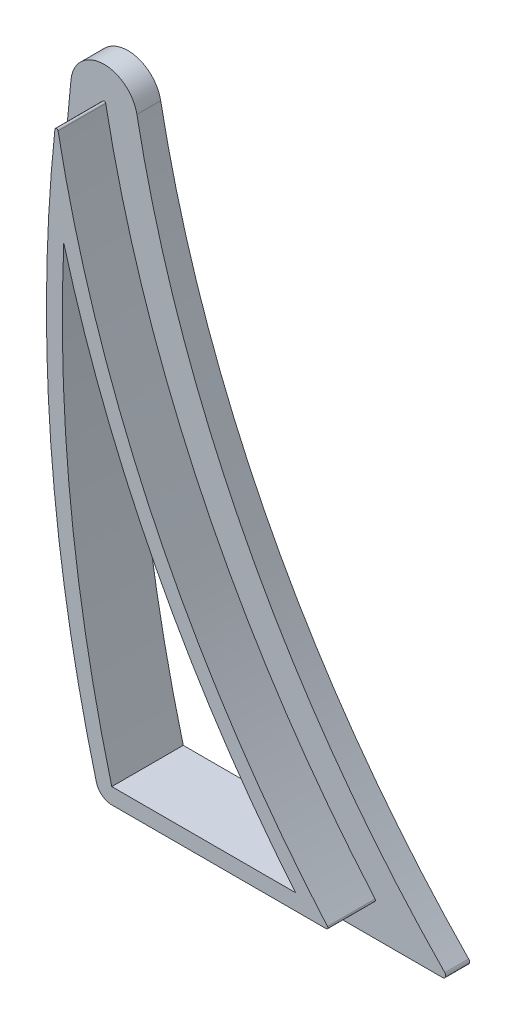
ISO-10303-21;
HEADER;
FILE_DESCRIPTION(('STEP AP214'),'2;1');
FILE_NAME('part.step','',(''),(''),'','','');
FILE_SCHEMA(('AUTOMOTIVE_DESIGN { 1 0 10303 214 1 1 1 1 }'));
ENDSEC;
DATA;
#1=APPLICATION_CONTEXT('core data for automotive mechanical design processes');
#2=APPLICATION_PROTOCOL_DEFINITION('international standard','automotive_design',2000,#1);
#3=PRODUCT_CONTEXT('',#1,'mechanical');
#4=PRODUCT('Part','Part','',(#3));
#5=PRODUCT_RELATED_PRODUCT_CATEGORY('part','',(#4));
#6=PRODUCT_DEFINITION_FORMATION('','',#4);
#7=PRODUCT_DEFINITION_CONTEXT('part definition',#1,'design');
#8=PRODUCT_DEFINITION('design','',#6,#7);
#9=PRODUCT_DEFINITION_SHAPE('','',#8);
#10=(LENGTH_UNIT() NAMED_UNIT(*) SI_UNIT(.MILLI.,.METRE.));
#11=(NAMED_UNIT(*) PLANE_ANGLE_UNIT() SI_UNIT($,.RADIAN.));
#12=(NAMED_UNIT(*) SI_UNIT($,.STERADIAN.) SOLID_ANGLE_UNIT());
#13=UNCERTAINTY_MEASURE_WITH_UNIT(LENGTH_MEASURE(1.E-05),#10,'distance_accuracy_value','');
#14=(GEOMETRIC_REPRESENTATION_CONTEXT(3) GLOBAL_UNCERTAINTY_ASSIGNED_CONTEXT((#13)) GLOBAL_UNIT_ASSIGNED_CONTEXT((#10,
#11,#12)) REPRESENTATION_CONTEXT('',''));
#15=CARTESIAN_POINT('',(0.,0.,0.));
#16=DIRECTION('',(0.,0.,1.));
#17=DIRECTION('',(1.,0.,0.));
#18=AXIS2_PLACEMENT_3D('',#15,#16,#17);
#19=CARTESIAN_POINT('',(65.7323224991207,31.1375568016993,3.));
#20=DIRECTION('',(0.,0.,-1.));
#21=DIRECTION('',(-1.,0.,0.));
#22=AXIS2_PLACEMENT_3D('',#19,#20,#21);
#23=CYLINDRICAL_SURFACE('',#22,75.);
#24=CARTESIAN_POINT('',(65.7323224991207,31.1375568016993,3.));
#25=DIRECTION('',(0.,0.,1.));
#26=DIRECTION('',(1.,0.,0.));
#27=AXIS2_PLACEMENT_3D('',#24,#25,#26);
#28=CIRCLE('',#27,75.);
#29=CARTESIAN_POINT('',(-7.90817231299797,16.9221593810739,3.));
#30=VERTEX_POINT('',#29);
#31=CARTESIAN_POINT('',(9.0550928824167,-17.9816007946541,3.));
#32=VERTEX_POINT('',#31);
#33=EDGE_CURVE('E261',#30,#32,#28,.T.);
#34=ORIENTED_EDGE('',*,*,#33,.T.);
#35=DIRECTION('',(0.,0.,-1.));
#36=VECTOR('',#35,1.);
#37=CARTESIAN_POINT('',(9.05509288241668,-17.9816007946541,3.));
#38=LINE('',#37,#36);
#39=CARTESIAN_POINT('',(9.0550928824167,-17.9816007946541,0.));
#40=VERTEX_POINT('',#39);
#41=EDGE_CURVE('E325',#32,#40,#38,.T.);
#42=ORIENTED_EDGE('',*,*,#41,.T.);
#43=CARTESIAN_POINT('',(65.7323224991207,31.1375568016993,0.));
#44=DIRECTION('',(0.,0.,1.));
#45=DIRECTION('',(1.,0.,0.));
#46=AXIS2_PLACEMENT_3D('',#43,#44,#45);
#47=CIRCLE('',#46,75.);
#48=CARTESIAN_POINT('',(-7.90817231299797,16.9221593810739,0.));
#49=VERTEX_POINT('',#48);
#50=EDGE_CURVE('E243',#49,#40,#47,.T.);
#51=ORIENTED_EDGE('',*,*,#50,.F.);
#52=DIRECTION('',(0.,0.,-1.));
#53=VECTOR('',#52,1.);
#54=CARTESIAN_POINT('',(-7.90817231299798,16.9221593810739,3.));
#55=LINE('',#54,#53);
#56=EDGE_CURVE('E306',#49,#30,#55,.F.);
#57=ORIENTED_EDGE('',*,*,#56,.T.);
#58=EDGE_LOOP('',(#34,#42,#51,#57));
#59=FACE_BOUND('',#58,.T.);
#60=ADVANCED_FACE('F63',(#59),#23,.F.);
#61=CARTESIAN_POINT('',(86.3599558529587,6.85290699521738,3.));
#62=DIRECTION('',(0.,0.,-1.));
#63=DIRECTION('',(-1.,0.,0.));
#64=AXIS2_PLACEMENT_3D('',#61,#62,#63);
#65=CYLINDRICAL_SURFACE('',#64,95.);
#66=CARTESIAN_POINT('',(86.3599558529587,6.85290699521738,3.));
#67=DIRECTION('',(0.,0.,1.));
#68=DIRECTION('',(1.,0.,0.));
#69=AXIS2_PLACEMENT_3D('',#66,#67,#68);
#70=CIRCLE('',#69,95.);
#71=CARTESIAN_POINT('',(-8.1057972742849,16.9137959272485,3.));
#72=VERTEX_POINT('',#71);
#73=CARTESIAN_POINT('',(-5.49144311833216,-17.4024121537188,3.));
#74=VERTEX_POINT('',#73);
#75=EDGE_CURVE('E265',#72,#74,#70,.T.);
#76=ORIENTED_EDGE('',*,*,#75,.F.);
#77=DIRECTION('',(0.,0.,-1.));
#78=VECTOR('',#77,1.);
#79=CARTESIAN_POINT('',(-8.1057972742849,16.9137959272485,3.));
#80=LINE('',#79,#78);
#81=CARTESIAN_POINT('',(-8.1057972742849,16.9137959272485,0.));
#82=VERTEX_POINT('',#81);
#83=EDGE_CURVE('E294',#72,#82,#80,.T.);
#84=ORIENTED_EDGE('',*,*,#83,.T.);
#85=CARTESIAN_POINT('',(86.3599558529587,6.85290699521738,0.));
#86=DIRECTION('',(0.,0.,1.));
#87=DIRECTION('',(1.,0.,0.));
#88=AXIS2_PLACEMENT_3D('',#85,#86,#87);
#89=CIRCLE('',#88,95.);
#90=CARTESIAN_POINT('',(-5.49144311833216,-17.4024121537188,0.));
#91=VERTEX_POINT('',#90);
#92=EDGE_CURVE('E276',#82,#91,#89,.T.);
#93=ORIENTED_EDGE('',*,*,#92,.T.);
#94=DIRECTION('',(0.,0.,-1.));
#95=VECTOR('',#94,1.);
#96=CARTESIAN_POINT('',(-5.49144311833216,-17.4024121537188,3.));
#97=LINE('',#96,#95);
#98=EDGE_CURVE('E290',#74,#91,#97,.T.);
#99=ORIENTED_EDGE('',*,*,#98,.F.);
#100=EDGE_LOOP('',(#76,#84,#93,#99));
#101=FACE_BOUND('',#100,.T.);
#102=ADVANCED_FACE('F349',(#101),#65,.T.);
#103=CARTESIAN_POINT('',(-4.52458628705541,-17.1470930047826,3.));
#104=DIRECTION('',(0.,0.,-1.));
#105=DIRECTION('',(-1.,0.,0.));
#106=AXIS2_PLACEMENT_3D('',#103,#104,#105);
#107=CYLINDRICAL_SURFACE('',#106,0.999999999999999);
#108=CARTESIAN_POINT('',(-4.52458628705541,-17.1470930047826,0.));
#109=DIRECTION('',(0.,0.,1.));
#110=DIRECTION('',(1.,0.,0.));
#111=AXIS2_PLACEMENT_3D('',#108,#109,#110);
#112=CIRCLE('',#111,0.999999999999999);
#113=CARTESIAN_POINT('',(-4.52458628705541,-18.1470930047826,0.));
#114=VERTEX_POINT('',#113);
#115=EDGE_CURVE('E280',#91,#114,#112,.T.);
#116=ORIENTED_EDGE('',*,*,#115,.T.);
#117=DIRECTION('',(0.,0.,-1.));
#118=VECTOR('',#117,1.);
#119=CARTESIAN_POINT('',(-4.52458628705541,-18.1470930047826,3.));
#120=LINE('',#119,#118);
#121=CARTESIAN_POINT('',(-4.52458628705541,-18.1470930047826,3.));
#122=VERTEX_POINT('',#121);
#123=EDGE_CURVE('E286',#122,#114,#120,.T.);
#124=ORIENTED_EDGE('',*,*,#123,.F.);
#125=CARTESIAN_POINT('',(-4.52458628705541,-17.1470930047826,3.));
#126=DIRECTION('',(0.,0.,1.));
#127=DIRECTION('',(1.,0.,0.));
#128=AXIS2_PLACEMENT_3D('',#125,#126,#127);
#129=CIRCLE('',#128,0.999999999999999);
#130=EDGE_CURVE('E268',#74,#122,#129,.T.);
#131=ORIENTED_EDGE('',*,*,#130,.F.);
#132=ORIENTED_EDGE('',*,*,#98,.T.);
#133=EDGE_LOOP('',(#116,#124,#131,#132));
#134=FACE_BOUND('',#133,.T.);
#135=ADVANCED_FACE('F354',(#134),#107,.T.);
#136=CARTESIAN_POINT('',(86.3599558529587,6.85290699521738,3.));
#137=DIRECTION('',(0.,0.,-1.));
#138=DIRECTION('',(-1.,0.,0.));
#139=AXIS2_PLACEMENT_3D('',#136,#137,#138);
#140=CYLINDRICAL_SURFACE('',#139,94.);
#141=DIRECTION('',(0.,0.,-1.));
#142=VECTOR('',#141,1.);
#143=CARTESIAN_POINT('',(-4.52458628705541,-17.1470930047826,3.));
#144=LINE('',#143,#142);
#145=CARTESIAN_POINT('',(-4.52458628705541,-17.1470930047826,3.));
#146=VERTEX_POINT('',#145);
#147=CARTESIAN_POINT('',(-4.52458628705541,-17.1470930047826,-1.5));
#148=VERTEX_POINT('',#147);
#149=EDGE_CURVE('E169',#146,#148,#144,.T.);
#150=ORIENTED_EDGE('',*,*,#149,.T.);
#151=CARTESIAN_POINT('',(86.3599558529587,6.85290699521738,-1.5));
#152=DIRECTION('',(0.,0.,1.));
#153=DIRECTION('',(1.,0.,0.));
#154=AXIS2_PLACEMENT_3D('',#151,#152,#153);
#155=CIRCLE('',#154,94.);
#156=CARTESIAN_POINT('',(-7.54889357039104,10.9915057898128,-1.5));
#157=VERTEX_POINT('',#156);
#158=EDGE_CURVE('E173',#148,#157,#155,.F.);
#159=ORIENTED_EDGE('',*,*,#158,.T.);
#160=DIRECTION('',(0.,0.,-1.));
#161=VECTOR('',#160,1.);
#162=CARTESIAN_POINT('',(-7.54889357039104,10.9915057898128,3.));
#163=LINE('',#162,#161);
#164=CARTESIAN_POINT('',(-7.54889357039104,10.9915057898128,3.));
#165=VERTEX_POINT('',#164);
#166=EDGE_CURVE('E291',#165,#157,#163,.T.);
#167=ORIENTED_EDGE('',*,*,#166,.F.);
#168=CARTESIAN_POINT('',(86.3599558529587,6.85290699521738,3.));
#169=DIRECTION('',(0.,0.,1.));
#170=DIRECTION('',(1.,0.,0.));
#171=AXIS2_PLACEMENT_3D('',#168,#169,#170);
#172=CIRCLE('',#171,94.);
#173=EDGE_CURVE('E176',#165,#146,#172,.T.);
#174=ORIENTED_EDGE('',*,*,#173,.T.);
#175=EDGE_LOOP('',(#150,#159,#167,#174));
#176=FACE_BOUND('',#175,.T.);
#177=ADVANCED_FACE('F171',(#176),#140,.F.);
#178=CARTESIAN_POINT('',(65.7323224991207,31.1375568016993,3.));
#179=DIRECTION('',(0.,0.,-1.));
#180=DIRECTION('',(-1.,0.,0.));
#181=AXIS2_PLACEMENT_3D('',#178,#179,#180);
#182=CYLINDRICAL_SURFACE('',#181,76.);
#183=ORIENTED_EDGE('',*,*,#166,.T.);
#184=CARTESIAN_POINT('',(65.7323224991207,31.1375568016993,-1.5));
#185=DIRECTION('',(0.,0.,1.));
#186=DIRECTION('',(1.,0.,0.));
#187=AXIS2_PLACEMENT_3D('',#184,#185,#186);
#188=CIRCLE('',#187,76.);
#189=CARTESIAN_POINT('',(7.04167083239099,-17.1470930047826,-1.5));
#190=VERTEX_POINT('',#189);
#191=EDGE_CURVE('E191',#157,#190,#188,.T.);
#192=ORIENTED_EDGE('',*,*,#191,.T.);
#193=DIRECTION('',(0.,0.,-1.));
#194=VECTOR('',#193,1.);
#195=CARTESIAN_POINT('',(7.04167083239099,-17.1470930047826,3.));
#196=LINE('',#195,#194);
#197=CARTESIAN_POINT('',(7.04167083239099,-17.1470930047826,3.));
#198=VERTEX_POINT('',#197);
#199=EDGE_CURVE('E181',#198,#190,#196,.T.);
#200=ORIENTED_EDGE('',*,*,#199,.F.);
#201=CARTESIAN_POINT('',(65.7323224991207,31.1375568016993,3.));
#202=DIRECTION('',(0.,0.,1.));
#203=DIRECTION('',(1.,0.,0.));
#204=AXIS2_PLACEMENT_3D('',#201,#202,#203);
#205=CIRCLE('',#204,76.);
#206=EDGE_CURVE('E254',#165,#198,#205,.T.);
#207=ORIENTED_EDGE('',*,*,#206,.F.);
#208=EDGE_LOOP('',(#183,#192,#200,#207));
#209=FACE_BOUND('',#208,.T.);
#210=ADVANCED_FACE('F362',(#209),#182,.T.);
#211=CARTESIAN_POINT('',(0.,-17.1470930047826,3.));
#212=DIRECTION('',(0.,1.,0.));
#213=DIRECTION('',(0.,0.,1.));
#214=AXIS2_PLACEMENT_3D('',#211,#212,#213);
#215=PLANE('',#214);
#216=ORIENTED_EDGE('',*,*,#199,.T.);
#217=DIRECTION('',(-1.,0.,0.));
#218=VECTOR('',#217,1.);
#219=CARTESIAN_POINT('',(0.,-17.1470930047826,-1.5));
#220=LINE('',#219,#218);
#221=EDGE_CURVE('E185',#190,#148,#220,.T.);
#222=ORIENTED_EDGE('',*,*,#221,.T.);
#223=ORIENTED_EDGE('',*,*,#149,.F.);
#224=DIRECTION('',(1.,0.,0.));
#225=VECTOR('',#224,1.);
#226=CARTESIAN_POINT('',(0.,-17.1470930047826,3.));
#227=LINE('',#226,#225);
#228=EDGE_CURVE('E258',#146,#198,#227,.T.);
#229=ORIENTED_EDGE('',*,*,#228,.T.);
#230=EDGE_LOOP('',(#216,#222,#223,#229));
#231=FACE_BOUND('',#230,.T.);
#232=ADVANCED_FACE('F186',(#231),#215,.T.);
#233=CARTESIAN_POINT('',(0.,-18.1470930047826,3.));
#234=DIRECTION('',(0.,1.,0.));
#235=DIRECTION('',(-1.,0.,0.));
#236=AXIS2_PLACEMENT_3D('',#233,#234,#235);
#237=PLANE('',#236);
#238=DIRECTION('',(1.,0.,0.));
#239=VECTOR('',#238,1.);
#240=CARTESIAN_POINT('',(0.,-18.1470930047826,0.));
#241=LINE('',#240,#239);
#242=CARTESIAN_POINT('',(8.97952324292775,-18.1470930047826,0.));
#243=VERTEX_POINT('',#242);
#244=EDGE_CURVE('E255',#114,#243,#241,.T.);
#245=ORIENTED_EDGE('',*,*,#244,.T.);
#246=DIRECTION('',(0.,0.,1.));
#247=VECTOR('',#246,1.);
#248=CARTESIAN_POINT('',(8.97952324292775,-18.1470930047826,3.));
#249=LINE('',#248,#247);
#250=CARTESIAN_POINT('',(8.97952324292775,-18.1470930047826,3.));
#251=VERTEX_POINT('',#250);
#252=EDGE_CURVE('E79',#243,#251,#249,.T.);
#253=ORIENTED_EDGE('',*,*,#252,.T.);
#254=DIRECTION('',(1.,0.,0.));
#255=VECTOR('',#254,1.);
#256=CARTESIAN_POINT('',(0.,-18.1470930047826,3.));
#257=LINE('',#256,#255);
#258=EDGE_CURVE('E182',#122,#251,#257,.T.);
#259=ORIENTED_EDGE('',*,*,#258,.F.);
#260=ORIENTED_EDGE('',*,*,#123,.T.);
#261=EDGE_LOOP('',(#245,#253,#259,#260));
#262=FACE_BOUND('',#261,.T.);
#263=ADVANCED_FACE('F361',(#262),#237,.F.);
#264=CARTESIAN_POINT('',(0.,0.,3.));
#265=DIRECTION('',(0.,0.,1.));
#266=DIRECTION('',(1.,0.,0.));
#267=AXIS2_PLACEMENT_3D('',#264,#265,#266);
#268=PLANE('',#267);
#269=ORIENTED_EDGE('',*,*,#173,.F.);
#270=ORIENTED_EDGE('',*,*,#206,.T.);
#271=ORIENTED_EDGE('',*,*,#228,.F.);
#272=EDGE_LOOP('',(#269,#270,#271));
#273=FACE_BOUND('',#272,.T.);
#274=ORIENTED_EDGE('',*,*,#258,.T.);
#275=CARTESIAN_POINT('',(8.97952324292775,-18.0470930047826,3.));
#276=DIRECTION('',(0.,0.,1.));
#277=DIRECTION('',(1.,0.,0.));
#278=AXIS2_PLACEMENT_3D('',#275,#276,#277);
#279=CIRCLE('',#278,0.1);
#280=EDGE_CURVE('E72',#251,#32,#279,.T.);
#281=ORIENTED_EDGE('',*,*,#280,.T.);
#282=ORIENTED_EDGE('',*,*,#33,.F.);
#283=CARTESIAN_POINT('',(-8.00635963941412,16.9032055178464,3.));
#284=DIRECTION('',(0.,0.,1.));
#285=DIRECTION('',(1.,0.,0.));
#286=AXIS2_PLACEMENT_3D('',#283,#284,#285);
#287=CIRCLE('',#286,0.1);
#288=EDGE_CURVE('E309',#30,#72,#287,.T.);
#289=ORIENTED_EDGE('',*,*,#288,.T.);
#290=ORIENTED_EDGE('',*,*,#75,.T.);
#291=ORIENTED_EDGE('',*,*,#130,.T.);
#292=EDGE_LOOP('',(#274,#281,#282,#289,#290,#291));
#293=FACE_BOUND('',#292,.T.);
#294=ADVANCED_FACE('F334',(#273,#293),#268,.T.);
#295=CARTESIAN_POINT('',(-8.00635963941412,16.9032055178464,3.));
#296=DIRECTION('',(0.,0.,1.));
#297=DIRECTION('',(1.,0.,0.));
#298=AXIS2_PLACEMENT_3D('',#295,#296,#297);
#299=CYLINDRICAL_SURFACE('',#298,0.1);
#300=ORIENTED_EDGE('',*,*,#288,.F.);
#301=ORIENTED_EDGE('',*,*,#56,.F.);
#302=CARTESIAN_POINT('',(-8.00635963941412,16.9032055178464,0.));
#303=DIRECTION('',(0.,0.,1.));
#304=DIRECTION('',(1.,0.,0.));
#305=AXIS2_PLACEMENT_3D('',#302,#303,#304);
#306=CIRCLE('',#305,0.1);
#307=EDGE_CURVE('E303',#82,#49,#306,.F.);
#308=ORIENTED_EDGE('',*,*,#307,.F.);
#309=ORIENTED_EDGE('',*,*,#83,.F.);
#310=EDGE_LOOP('',(#300,#301,#308,#309));
#311=FACE_BOUND('',#310,.T.);
#312=ADVANCED_FACE('F368',(#311),#299,.T.);
#313=CARTESIAN_POINT('',(-8.00635963941412,16.9032055178464,-1.5));
#314=DIRECTION('',(0.,0.,1.));
#315=DIRECTION('',(1.,0.,0.));
#316=AXIS2_PLACEMENT_3D('',#313,#314,#315);
#317=PLANE('',#316);
#318=CARTESIAN_POINT('',(65.7323224991207,31.1375568016993,-1.5));
#319=DIRECTION('',(0.,0.,1.));
#320=DIRECTION('',(1.,0.,0.));
#321=AXIS2_PLACEMENT_3D('',#318,#319,#320);
#322=CIRCLE('',#321,73.);
#323=CARTESIAN_POINT('',(-5.9444257846748,17.301236645624,-1.5));
#324=VERTEX_POINT('',#323);
#325=CARTESIAN_POINT('',(13.4484874390779,-19.8075174588633,-1.5));
#326=VERTEX_POINT('',#325);
#327=EDGE_CURVE('E217',#324,#326,#322,.T.);
#328=ORIENTED_EDGE('',*,*,#327,.T.);
#329=CARTESIAN_POINT('',(13.3052440553517,-19.9470930047826,-1.5));
#330=DIRECTION('',(0.,0.,1.));
#331=DIRECTION('',(1.,0.,0.));
#332=AXIS2_PLACEMENT_3D('',#329,#330,#331);
#333=CIRCLE('',#332,0.2);
#334=CARTESIAN_POINT('',(13.3052440553517,-20.1470930047826,-1.5));
#335=VERTEX_POINT('',#334);
#336=EDGE_CURVE('E322',#326,#335,#333,.F.);
#337=ORIENTED_EDGE('',*,*,#336,.T.);
#338=DIRECTION('',(1.,0.,0.));
#339=VECTOR('',#338,1.);
#340=CARTESIAN_POINT('',(-4.52458628705542,-20.1470930047826,-1.5));
#341=LINE('',#340,#339);
#342=CARTESIAN_POINT('',(-4.52458628705542,-20.1470930047826,-1.5));
#343=VERTEX_POINT('',#342);
#344=EDGE_CURVE('E213',#343,#335,#341,.T.);
#345=ORIENTED_EDGE('',*,*,#344,.F.);
#346=CARTESIAN_POINT('',(-4.52458628705541,-17.1470930047826,-1.5));
#347=DIRECTION('',(0.,0.,1.));
#348=DIRECTION('',(1.,0.,0.));
#349=AXIS2_PLACEMENT_3D('',#346,#347,#348);
#350=CIRCLE('',#349,3.);
#351=CARTESIAN_POINT('',(-7.42515678088566,-17.9130504515911,-1.5));
#352=VERTEX_POINT('',#351);
#353=EDGE_CURVE('E209',#352,#343,#350,.T.);
#354=ORIENTED_EDGE('',*,*,#353,.F.);
#355=CARTESIAN_POINT('',(86.3599558529587,6.85290699521738,-1.5));
#356=DIRECTION('',(0.,0.,1.));
#357=DIRECTION('',(1.,0.,0.));
#358=AXIS2_PLACEMENT_3D('',#355,#356,#357);
#359=CIRCLE('',#358,97.);
#360=CARTESIAN_POINT('',(-10.0945499717006,17.1256041152913,-1.5));
#361=VERTEX_POINT('',#360);
#362=EDGE_CURVE('E204',#361,#352,#359,.T.);
#363=ORIENTED_EDGE('',*,*,#362,.F.);
#364=CARTESIAN_POINT('',(-8.00635963941412,16.9032055178464,-1.5));
#365=DIRECTION('',(0.,0.,1.));
#366=DIRECTION('',(1.,0.,0.));
#367=AXIS2_PLACEMENT_3D('',#364,#365,#366);
#368=CIRCLE('',#367,2.1);
#369=EDGE_CURVE('E200',#324,#361,#368,.T.);
#370=ORIENTED_EDGE('',*,*,#369,.F.);
#371=EDGE_LOOP('',(#328,#337,#345,#354,#363,#370));
#372=FACE_BOUND('',#371,.T.);
#373=ORIENTED_EDGE('',*,*,#158,.F.);
#374=ORIENTED_EDGE('',*,*,#221,.F.);
#375=ORIENTED_EDGE('',*,*,#191,.F.);
#376=EDGE_LOOP('',(#373,#374,#375));
#377=FACE_BOUND('',#376,.T.);
#378=ADVANCED_FACE('F193',(#372,#377),#317,.F.);
#379=CARTESIAN_POINT('',(-8.00635963941412,16.9032055178464,0.));
#380=DIRECTION('',(0.,0.,1.));
#381=DIRECTION('',(1.,0.,0.));
#382=AXIS2_PLACEMENT_3D('',#379,#380,#381);
#383=PLANE('',#382);
#384=ORIENTED_EDGE('',*,*,#92,.F.);
#385=ORIENTED_EDGE('',*,*,#307,.T.);
#386=ORIENTED_EDGE('',*,*,#50,.T.);
#387=CARTESIAN_POINT('',(8.97952324292775,-18.0470930047826,0.));
#388=DIRECTION('',(0.,0.,1.));
#389=DIRECTION('',(1.,0.,0.));
#390=AXIS2_PLACEMENT_3D('',#387,#388,#389);
#391=CIRCLE('',#390,0.1);
#392=EDGE_CURVE('E12',#40,#243,#391,.F.);
#393=ORIENTED_EDGE('',*,*,#392,.T.);
#394=ORIENTED_EDGE('',*,*,#244,.F.);
#395=ORIENTED_EDGE('',*,*,#115,.F.);
#396=EDGE_LOOP('',(#384,#385,#386,#393,#394,#395));
#397=FACE_BOUND('',#396,.T.);
#398=DIRECTION('',(1.,0.,0.));
#399=VECTOR('',#398,1.);
#400=CARTESIAN_POINT('',(-4.52458628705542,-20.1470930047826,0.));
#401=LINE('',#400,#399);
#402=CARTESIAN_POINT('',(-4.52458628705542,-20.1470930047826,0.));
#403=VERTEX_POINT('',#402);
#404=CARTESIAN_POINT('',(13.3052440553517,-20.1470930047826,0.));
#405=VERTEX_POINT('',#404);
#406=EDGE_CURVE('E233',#403,#405,#401,.T.);
#407=ORIENTED_EDGE('',*,*,#406,.T.);
#408=CARTESIAN_POINT('',(13.3052440553517,-19.9470930047826,0.));
#409=DIRECTION('',(0.,0.,1.));
#410=DIRECTION('',(1.,0.,0.));
#411=AXIS2_PLACEMENT_3D('',#408,#409,#410);
#412=CIRCLE('',#411,0.2);
#413=CARTESIAN_POINT('',(13.4484874390779,-19.8075174588633,0.));
#414=VERTEX_POINT('',#413);
#415=EDGE_CURVE('E316',#405,#414,#412,.T.);
#416=ORIENTED_EDGE('',*,*,#415,.T.);
#417=CARTESIAN_POINT('',(65.7323224991207,31.1375568016993,0.));
#418=DIRECTION('',(0.,0.,1.));
#419=DIRECTION('',(1.,0.,0.));
#420=AXIS2_PLACEMENT_3D('',#417,#418,#419);
#421=CIRCLE('',#420,73.);
#422=CARTESIAN_POINT('',(-5.9444257846748,17.301236645624,0.));
#423=VERTEX_POINT('',#422);
#424=EDGE_CURVE('E205',#423,#414,#421,.T.);
#425=ORIENTED_EDGE('',*,*,#424,.F.);
#426=CARTESIAN_POINT('',(-8.00635963941412,16.9032055178464,0.));
#427=DIRECTION('',(0.,0.,1.));
#428=DIRECTION('',(1.,0.,0.));
#429=AXIS2_PLACEMENT_3D('',#426,#427,#428);
#430=CIRCLE('',#429,2.1);
#431=CARTESIAN_POINT('',(-10.0945499717006,17.1256041152913,0.));
#432=VERTEX_POINT('',#431);
#433=EDGE_CURVE('E199',#423,#432,#430,.T.);
#434=ORIENTED_EDGE('',*,*,#433,.T.);
#435=CARTESIAN_POINT('',(86.3599558529587,6.85290699521738,0.));
#436=DIRECTION('',(0.,0.,1.));
#437=DIRECTION('',(1.,0.,0.));
#438=AXIS2_PLACEMENT_3D('',#435,#436,#437);
#439=CIRCLE('',#438,97.);
#440=CARTESIAN_POINT('',(-7.42515678088566,-17.9130504515911,0.));
#441=VERTEX_POINT('',#440);
#442=EDGE_CURVE('E225',#432,#441,#439,.T.);
#443=ORIENTED_EDGE('',*,*,#442,.T.);
#444=CARTESIAN_POINT('',(-4.52458628705541,-17.1470930047826,0.));
#445=DIRECTION('',(0.,0.,1.));
#446=DIRECTION('',(1.,0.,0.));
#447=AXIS2_PLACEMENT_3D('',#444,#445,#446);
#448=CIRCLE('',#447,3.);
#449=EDGE_CURVE('E229',#441,#403,#448,.T.);
#450=ORIENTED_EDGE('',*,*,#449,.T.);
#451=EDGE_LOOP('',(#407,#416,#425,#434,#443,#450));
#452=FACE_BOUND('',#451,.T.);
#453=ADVANCED_FACE('F375',(#397,#452),#383,.T.);
#454=CARTESIAN_POINT('',(-8.00635963941412,16.9032055178464,-1.5));
#455=DIRECTION('',(0.,0.,1.));
#456=DIRECTION('',(1.,0.,0.));
#457=AXIS2_PLACEMENT_3D('',#454,#455,#456);
#458=CYLINDRICAL_SURFACE('',#457,2.1);
#459=ORIENTED_EDGE('',*,*,#433,.F.);
#460=DIRECTION('',(0.,0.,1.));
#461=VECTOR('',#460,1.);
#462=CARTESIAN_POINT('',(-5.9444257846748,17.301236645624,-1.5));
#463=LINE('',#462,#461);
#464=EDGE_CURVE('E240',#324,#423,#463,.T.);
#465=ORIENTED_EDGE('',*,*,#464,.F.);
#466=ORIENTED_EDGE('',*,*,#369,.T.);
#467=DIRECTION('',(0.,0.,1.));
#468=VECTOR('',#467,1.);
#469=CARTESIAN_POINT('',(-10.0945499717006,17.1256041152913,-1.5));
#470=LINE('',#469,#468);
#471=EDGE_CURVE('E221',#361,#432,#470,.T.);
#472=ORIENTED_EDGE('',*,*,#471,.T.);
#473=EDGE_LOOP('',(#459,#465,#466,#472));
#474=FACE_BOUND('',#473,.T.);
#475=ADVANCED_FACE('F389',(#474),#458,.T.);
#476=CARTESIAN_POINT('',(65.7323224991207,31.1375568016993,-1.5));
#477=DIRECTION('',(0.,0.,1.));
#478=DIRECTION('',(1.,0.,0.));
#479=AXIS2_PLACEMENT_3D('',#476,#477,#478);
#480=CYLINDRICAL_SURFACE('',#479,73.);
#481=ORIENTED_EDGE('',*,*,#424,.T.);
#482=DIRECTION('',(0.,0.,1.));
#483=VECTOR('',#482,1.);
#484=CARTESIAN_POINT('',(13.4484874390779,-19.8075174588633,-1.5));
#485=LINE('',#484,#483);
#486=EDGE_CURVE('E319',#414,#326,#485,.F.);
#487=ORIENTED_EDGE('',*,*,#486,.T.);
#488=ORIENTED_EDGE('',*,*,#327,.F.);
#489=ORIENTED_EDGE('',*,*,#464,.T.);
#490=EDGE_LOOP('',(#481,#487,#488,#489));
#491=FACE_BOUND('',#490,.T.);
#492=ADVANCED_FACE('F402',(#491),#480,.F.);
#493=CARTESIAN_POINT('',(-4.52458628705542,-20.1470930047826,-1.5));
#494=DIRECTION('',(0.,-1.,0.));
#495=DIRECTION('',(1.,0.,0.));
#496=AXIS2_PLACEMENT_3D('',#493,#494,#495);
#497=PLANE('',#496);
#498=ORIENTED_EDGE('',*,*,#344,.T.);
#499=DIRECTION('',(0.,0.,-1.));
#500=VECTOR('',#499,1.);
#501=CARTESIAN_POINT('',(13.3052440553517,-20.1470930047826,0.));
#502=LINE('',#501,#500);
#503=EDGE_CURVE('E312',#335,#405,#502,.F.);
#504=ORIENTED_EDGE('',*,*,#503,.T.);
#505=ORIENTED_EDGE('',*,*,#406,.F.);
#506=DIRECTION('',(0.,0.,1.));
#507=VECTOR('',#506,1.);
#508=CARTESIAN_POINT('',(-4.52458628705542,-20.1470930047826,-1.5));
#509=LINE('',#508,#507);
#510=EDGE_CURVE('E244',#343,#403,#509,.T.);
#511=ORIENTED_EDGE('',*,*,#510,.F.);
#512=EDGE_LOOP('',(#498,#504,#505,#511));
#513=FACE_BOUND('',#512,.T.);
#514=ADVANCED_FACE('F395',(#513),#497,.T.);
#515=CARTESIAN_POINT('',(-4.52458628705541,-17.1470930047826,-1.5));
#516=DIRECTION('',(0.,0.,1.));
#517=DIRECTION('',(1.,0.,0.));
#518=AXIS2_PLACEMENT_3D('',#515,#516,#517);
#519=CYLINDRICAL_SURFACE('',#518,3.);
#520=ORIENTED_EDGE('',*,*,#449,.F.);
#521=DIRECTION('',(0.,0.,1.));
#522=VECTOR('',#521,1.);
#523=CARTESIAN_POINT('',(-7.42515678088566,-17.9130504515911,-1.5));
#524=LINE('',#523,#522);
#525=EDGE_CURVE('E247',#352,#441,#524,.T.);
#526=ORIENTED_EDGE('',*,*,#525,.F.);
#527=ORIENTED_EDGE('',*,*,#353,.T.);
#528=ORIENTED_EDGE('',*,*,#510,.T.);
#529=EDGE_LOOP('',(#520,#526,#527,#528));
#530=FACE_BOUND('',#529,.T.);
#531=ADVANCED_FACE('F411',(#530),#519,.T.);
#532=CARTESIAN_POINT('',(86.3599558529587,6.85290699521738,-1.5));
#533=DIRECTION('',(0.,0.,1.));
#534=DIRECTION('',(1.,0.,0.));
#535=AXIS2_PLACEMENT_3D('',#532,#533,#534);
#536=CYLINDRICAL_SURFACE('',#535,97.);
#537=ORIENTED_EDGE('',*,*,#442,.F.);
#538=ORIENTED_EDGE('',*,*,#471,.F.);
#539=ORIENTED_EDGE('',*,*,#362,.T.);
#540=ORIENTED_EDGE('',*,*,#525,.T.);
#541=EDGE_LOOP('',(#537,#538,#539,#540));
#542=FACE_BOUND('',#541,.T.);
#543=ADVANCED_FACE('F346',(#542),#536,.T.);
#544=CARTESIAN_POINT('',(13.3052440553517,-19.9470930047826,-1.5));
#545=DIRECTION('',(0.,0.,1.));
#546=DIRECTION('',(1.,0.,0.));
#547=AXIS2_PLACEMENT_3D('',#544,#545,#546);
#548=CYLINDRICAL_SURFACE('',#547,0.2);
#549=ORIENTED_EDGE('',*,*,#336,.F.);
#550=ORIENTED_EDGE('',*,*,#486,.F.);
#551=ORIENTED_EDGE('',*,*,#415,.F.);
#552=ORIENTED_EDGE('',*,*,#503,.F.);
#553=EDGE_LOOP('',(#549,#550,#551,#552));
#554=FACE_BOUND('',#553,.T.);
#555=ADVANCED_FACE('F342',(#554),#548,.T.);
#556=CARTESIAN_POINT('',(8.97952324292775,-18.0470930047826,3.));
#557=DIRECTION('',(0.,0.,-1.));
#558=DIRECTION('',(-1.,0.,0.));
#559=AXIS2_PLACEMENT_3D('',#556,#557,#558);
#560=CYLINDRICAL_SURFACE('',#559,0.1);
#561=ORIENTED_EDGE('',*,*,#280,.F.);
#562=ORIENTED_EDGE('',*,*,#252,.F.);
#563=ORIENTED_EDGE('',*,*,#392,.F.);
#564=ORIENTED_EDGE('',*,*,#41,.F.);
#565=EDGE_LOOP('',(#561,#562,#563,#564));
#566=FACE_BOUND('',#565,.T.);
#567=ADVANCED_FACE('F65',(#566),#560,.T.);
#568=CLOSED_SHELL('',(#60,#102,#135,#177,#210,#232,#263,#294,#312,#378,#453,#475,#492,#514,#531,
#543,#555,#567));
#569=MANIFOLD_SOLID_BREP('B2',#568);
#570=ADVANCED_BREP_SHAPE_REPRESENTATION('',(#18,#569),#14);
#571=SHAPE_DEFINITION_REPRESENTATION(#9,#570);
ENDSEC;
END-ISO-10303-21;
